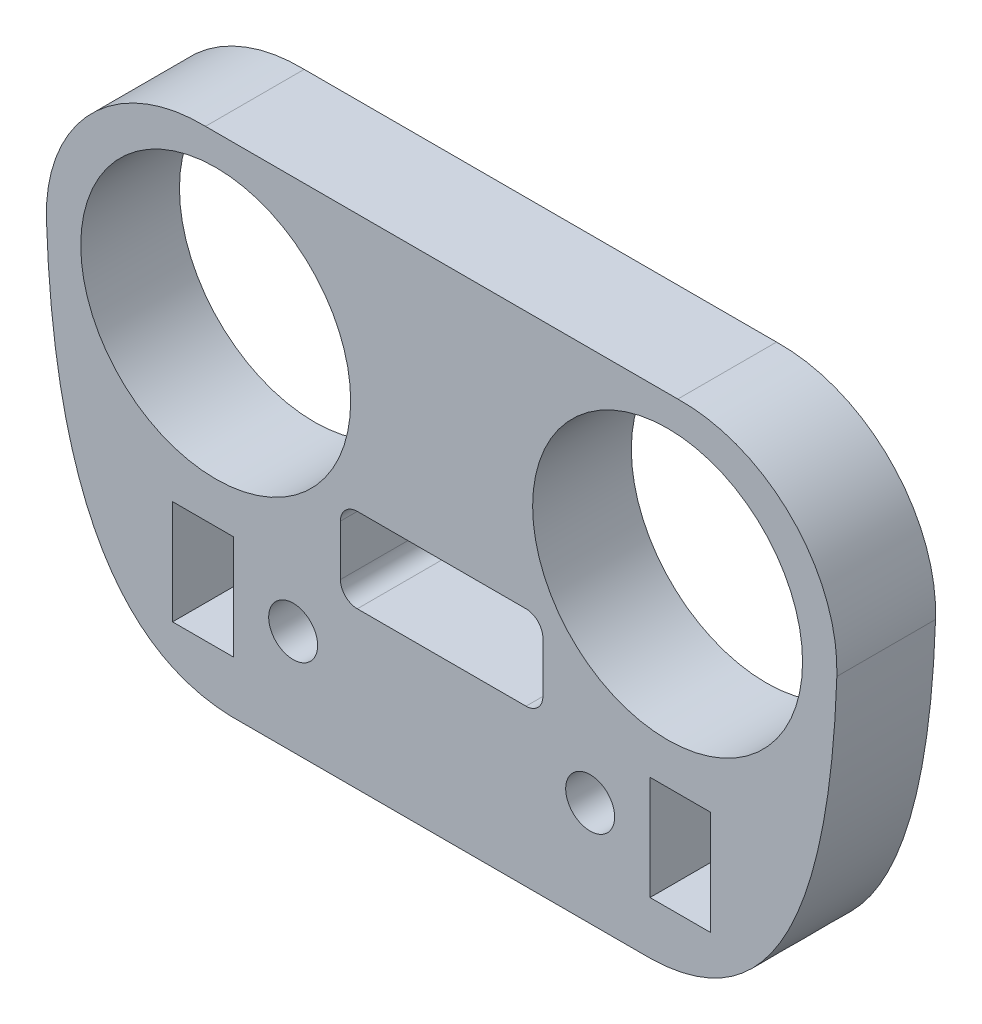
ISO-10303-21;
HEADER;
FILE_DESCRIPTION(('STEP AP214'),'2;1');
FILE_NAME('part.step','',(''),(''),'','','');
FILE_SCHEMA(('AUTOMOTIVE_DESIGN { 1 0 10303 214 1 1 1 1 }'));
ENDSEC;
DATA;
#1=APPLICATION_CONTEXT('core data for automotive mechanical design processes');
#2=APPLICATION_PROTOCOL_DEFINITION('international standard','automotive_design',2000,#1);
#3=PRODUCT_CONTEXT('',#1,'mechanical');
#4=PRODUCT('Part','Part','',(#3));
#5=PRODUCT_RELATED_PRODUCT_CATEGORY('part','',(#4));
#6=PRODUCT_DEFINITION_FORMATION('','',#4);
#7=PRODUCT_DEFINITION_CONTEXT('part definition',#1,'design');
#8=PRODUCT_DEFINITION('design','',#6,#7);
#9=PRODUCT_DEFINITION_SHAPE('','',#8);
#10=(LENGTH_UNIT() NAMED_UNIT(*) SI_UNIT(.MILLI.,.METRE.));
#11=(NAMED_UNIT(*) PLANE_ANGLE_UNIT() SI_UNIT($,.RADIAN.));
#12=(NAMED_UNIT(*) SI_UNIT($,.STERADIAN.) SOLID_ANGLE_UNIT());
#13=UNCERTAINTY_MEASURE_WITH_UNIT(LENGTH_MEASURE(1.E-05),#10,'distance_accuracy_value','');
#14=(GEOMETRIC_REPRESENTATION_CONTEXT(3) GLOBAL_UNCERTAINTY_ASSIGNED_CONTEXT((#13)) GLOBAL_UNIT_ASSIGNED_CONTEXT((#10,
#11,#12)) REPRESENTATION_CONTEXT('',''));
#15=CARTESIAN_POINT('',(0.,0.,0.));
#16=DIRECTION('',(0.,0.,1.));
#17=DIRECTION('',(1.,0.,0.));
#18=AXIS2_PLACEMENT_3D('',#15,#16,#17);
#19=CARTESIAN_POINT('',(540.459320757732,585.38923314869,5.85));
#20=DIRECTION('',(0.,0.,-1.));
#21=DIRECTION('',(-1.,0.,0.));
#22=AXIS2_PLACEMENT_3D('',#19,#20,#21);
#23=CYLINDRICAL_SURFACE('',#22,9.21331619618094);
#24=CARTESIAN_POINT('',(540.459320757732,585.38923314869,0.));
#25=DIRECTION('',(0.,0.,1.));
#26=DIRECTION('',(1.,0.,0.));
#27=AXIS2_PLACEMENT_3D('',#24,#25,#26);
#28=CIRCLE('',#27,9.21331619618094);
#29=CARTESIAN_POINT('',(531.251426748071,585.073190054068,0.));
#30=VERTEX_POINT('',#29);
#31=CARTESIAN_POINT('',(540.67744315862,594.599966992909,0.));
#32=VERTEX_POINT('',#31);
#33=EDGE_CURVE('E415',#30,#32,#28,.F.);
#34=ORIENTED_EDGE('',*,*,#33,.F.);
#35=DIRECTION('',(0.,0.,-1.));
#36=VECTOR('',#35,1.);
#37=CARTESIAN_POINT('',(531.251426748071,585.073190054068,5.85));
#38=LINE('',#37,#36);
#39=CARTESIAN_POINT('',(531.251426748071,585.073190054068,5.85));
#40=VERTEX_POINT('',#39);
#41=EDGE_CURVE('E11',#40,#30,#38,.T.);
#42=ORIENTED_EDGE('',*,*,#41,.F.);
#43=CARTESIAN_POINT('',(540.459320757732,585.38923314869,5.85));
#44=DIRECTION('',(0.,0.,1.));
#45=DIRECTION('',(1.,0.,0.));
#46=AXIS2_PLACEMENT_3D('',#43,#44,#45);
#47=CIRCLE('',#46,9.21331619618094);
#48=CARTESIAN_POINT('',(540.67744315862,594.599966992909,5.85));
#49=VERTEX_POINT('',#48);
#50=EDGE_CURVE('E244',#40,#49,#47,.F.);
#51=ORIENTED_EDGE('',*,*,#50,.T.);
#52=DIRECTION('',(0.,0.,-1.));
#53=VECTOR('',#52,1.);
#54=CARTESIAN_POINT('',(540.67744315862,594.599966992909,5.85));
#55=LINE('',#54,#53);
#56=EDGE_CURVE('E54',#49,#32,#55,.T.);
#57=ORIENTED_EDGE('',*,*,#56,.T.);
#58=EDGE_LOOP('',(#34,#42,#51,#57));
#59=FACE_BOUND('',#58,.T.);
#60=ADVANCED_FACE('F35',(#59),#23,.T.);
#61=CARTESIAN_POINT('',(531.251426748071,585.073190054068,5.85));
#62=CARTESIAN_POINT('',(531.926909632213,565.393042288273,5.85));
#63=CARTESIAN_POINT('',(542.192175731017,565.073190054068,5.85));
#64=B_SPLINE_CURVE_WITH_KNOTS('',2,(#61,#62,#63),.UNSPECIFIED.,.F.,.F.,(3,3),(0.,1.),.UNSPECIFIED.);
#65=DIRECTION('',(0.,0.,-1.));
#66=VECTOR('',#65,1.);
#67=SURFACE_OF_LINEAR_EXTRUSION('',#64,#66);
#68=CARTESIAN_POINT('',(531.251426748071,585.073190054068,0.));
#69=CARTESIAN_POINT('',(531.926909632213,565.393042288273,0.));
#70=CARTESIAN_POINT('',(542.192175731017,565.073190054068,0.));
#71=B_SPLINE_CURVE_WITH_KNOTS('',2,(#68,#69,#70),.UNSPECIFIED.,.F.,.F.,(3,3),(0.,1.),.UNSPECIFIED.);
#72=CARTESIAN_POINT('',(542.192175731017,565.073190054068,0.));
#73=VERTEX_POINT('',#72);
#74=EDGE_CURVE('E417',#30,#73,#71,.T.);
#75=ORIENTED_EDGE('',*,*,#74,.T.);
#76=DIRECTION('',(0.,0.,-1.));
#77=VECTOR('',#76,1.);
#78=CARTESIAN_POINT('',(542.192175731017,565.073190054068,5.85));
#79=LINE('',#78,#77);
#80=CARTESIAN_POINT('',(542.192175731017,565.073190054068,5.85));
#81=VERTEX_POINT('',#80);
#82=EDGE_CURVE('E45',#81,#73,#79,.T.);
#83=ORIENTED_EDGE('',*,*,#82,.F.);
#84=EDGE_CURVE('E216',#40,#81,#64,.T.);
#85=ORIENTED_EDGE('',*,*,#84,.F.);
#86=ORIENTED_EDGE('',*,*,#41,.T.);
#87=EDGE_LOOP('',(#75,#83,#85,#86));
#88=FACE_BOUND('',#87,.T.);
#89=ADVANCED_FACE('F234',(#88),#67,.F.);
#90=CARTESIAN_POINT('',(0.,565.073190054068,5.85));
#91=DIRECTION('',(0.,1.,0.));
#92=DIRECTION('',(0.,0.,1.));
#93=AXIS2_PLACEMENT_3D('',#90,#91,#92);
#94=PLANE('',#93);
#95=DIRECTION('',(1.,0.,0.));
#96=VECTOR('',#95,1.);
#97=CARTESIAN_POINT('',(0.,565.073190054068,0.));
#98=LINE('',#97,#96);
#99=CARTESIAN_POINT('',(567.160030566585,565.073190054068,0.));
#100=VERTEX_POINT('',#99);
#101=EDGE_CURVE('E422',#73,#100,#98,.T.);
#102=ORIENTED_EDGE('',*,*,#101,.T.);
#103=DIRECTION('',(0.,0.,-1.));
#104=VECTOR('',#103,1.);
#105=CARTESIAN_POINT('',(567.160030566585,565.073190054068,5.85));
#106=LINE('',#105,#104);
#107=CARTESIAN_POINT('',(567.160030566585,565.073190054068,5.85));
#108=VERTEX_POINT('',#107);
#109=EDGE_CURVE('E202',#108,#100,#106,.T.);
#110=ORIENTED_EDGE('',*,*,#109,.F.);
#111=DIRECTION('',(1.,0.,0.));
#112=VECTOR('',#111,1.);
#113=CARTESIAN_POINT('',(0.,565.073190054068,5.85));
#114=LINE('',#113,#112);
#115=EDGE_CURVE('E213',#81,#108,#114,.T.);
#116=ORIENTED_EDGE('',*,*,#115,.F.);
#117=ORIENTED_EDGE('',*,*,#82,.T.);
#118=EDGE_LOOP('',(#102,#110,#116,#117));
#119=FACE_BOUND('',#118,.T.);
#120=ADVANCED_FACE('F230',(#119),#94,.F.);
#121=CARTESIAN_POINT('',(578.100779549531,585.073190054068,5.85));
#122=CARTESIAN_POINT('',(577.425296665389,565.393042288278,5.85));
#123=CARTESIAN_POINT('',(567.160030566585,565.073190054068,5.85));
#124=B_SPLINE_CURVE_WITH_KNOTS('',2,(#121,#122,#123),.UNSPECIFIED.,.F.,.F.,(3,3),(0.,1.),.UNSPECIFIED.);
#125=DIRECTION('',(0.,0.,-1.));
#126=VECTOR('',#125,1.);
#127=SURFACE_OF_LINEAR_EXTRUSION('',#124,#126);
#128=CARTESIAN_POINT('',(578.100779549531,585.073190054068,0.));
#129=CARTESIAN_POINT('',(577.425296665389,565.393042288278,0.));
#130=CARTESIAN_POINT('',(567.160030566585,565.073190054068,0.));
#131=B_SPLINE_CURVE_WITH_KNOTS('',2,(#128,#129,#130),.UNSPECIFIED.,.F.,.F.,(3,3),(0.,1.),.UNSPECIFIED.);
#132=CARTESIAN_POINT('',(578.100779549531,585.073190054068,0.));
#133=VERTEX_POINT('',#132);
#134=EDGE_CURVE('E199',#133,#100,#131,.T.);
#135=ORIENTED_EDGE('',*,*,#134,.F.);
#136=DIRECTION('',(0.,0.,-1.));
#137=VECTOR('',#136,1.);
#138=CARTESIAN_POINT('',(578.100779549531,585.073190054068,5.85));
#139=LINE('',#138,#137);
#140=CARTESIAN_POINT('',(578.100779549531,585.073190054068,5.85));
#141=VERTEX_POINT('',#140);
#142=EDGE_CURVE('E193',#141,#133,#139,.T.);
#143=ORIENTED_EDGE('',*,*,#142,.F.);
#144=EDGE_CURVE('E197',#141,#108,#124,.T.);
#145=ORIENTED_EDGE('',*,*,#144,.T.);
#146=ORIENTED_EDGE('',*,*,#109,.T.);
#147=EDGE_LOOP('',(#135,#143,#145,#146));
#148=FACE_BOUND('',#147,.T.);
#149=ADVANCED_FACE('F195',(#148),#127,.T.);
#150=CARTESIAN_POINT('',(568.89288553987,585.38923314869,5.85));
#151=DIRECTION('',(0.,0.,-1.));
#152=DIRECTION('',(-1.,0.,0.));
#153=AXIS2_PLACEMENT_3D('',#150,#151,#152);
#154=CYLINDRICAL_SURFACE('',#153,9.21331619618094);
#155=CARTESIAN_POINT('',(568.89288553987,585.38923314869,0.));
#156=DIRECTION('',(0.,0.,1.));
#157=DIRECTION('',(1.,0.,0.));
#158=AXIS2_PLACEMENT_3D('',#155,#156,#157);
#159=CIRCLE('',#158,9.21331619618094);
#160=CARTESIAN_POINT('',(568.674763138983,594.599966992909,0.));
#161=VERTEX_POINT('',#160);
#162=EDGE_CURVE('E303',#133,#161,#159,.T.);
#163=ORIENTED_EDGE('',*,*,#162,.T.);
#164=DIRECTION('',(0.,0.,-1.));
#165=VECTOR('',#164,1.);
#166=CARTESIAN_POINT('',(568.674763138983,594.599966992909,5.85));
#167=LINE('',#166,#165);
#168=CARTESIAN_POINT('',(568.674763138983,594.599966992909,5.85));
#169=VERTEX_POINT('',#168);
#170=EDGE_CURVE('E122',#169,#161,#167,.T.);
#171=ORIENTED_EDGE('',*,*,#170,.F.);
#172=CARTESIAN_POINT('',(568.89288553987,585.38923314869,5.85));
#173=DIRECTION('',(0.,0.,1.));
#174=DIRECTION('',(1.,0.,0.));
#175=AXIS2_PLACEMENT_3D('',#172,#173,#174);
#176=CIRCLE('',#175,9.21331619618094);
#177=EDGE_CURVE('E204',#141,#169,#176,.T.);
#178=ORIENTED_EDGE('',*,*,#177,.F.);
#179=ORIENTED_EDGE('',*,*,#142,.T.);
#180=EDGE_LOOP('',(#163,#171,#178,#179));
#181=FACE_BOUND('',#180,.T.);
#182=ADVANCED_FACE('F205',(#181),#154,.T.);
#183=CARTESIAN_POINT('',(0.,574.359921054068,5.85));
#184=DIRECTION('',(0.,1.,0.));
#185=DIRECTION('',(0.,0.,1.));
#186=AXIS2_PLACEMENT_3D('',#183,#184,#185);
#187=PLANE('',#186);
#188=DIRECTION('',(1.,0.,0.));
#189=VECTOR('',#188,1.);
#190=CARTESIAN_POINT('',(0.,574.359921054068,0.));
#191=LINE('',#190,#189);
#192=CARTESIAN_POINT('',(538.725835586008,574.359921054068,0.));
#193=VERTEX_POINT('',#192);
#194=CARTESIAN_POINT('',(542.325835586008,574.359921054068,0.));
#195=VERTEX_POINT('',#194);
#196=EDGE_CURVE('E403',#193,#195,#191,.T.);
#197=ORIENTED_EDGE('',*,*,#196,.T.);
#198=DIRECTION('',(0.,0.,-1.));
#199=VECTOR('',#198,1.);
#200=CARTESIAN_POINT('',(542.325835586008,574.359921054068,5.85));
#201=LINE('',#200,#199);
#202=CARTESIAN_POINT('',(542.325835586008,574.359921054068,5.85));
#203=VERTEX_POINT('',#202);
#204=EDGE_CURVE('E310',#203,#195,#201,.T.);
#205=ORIENTED_EDGE('',*,*,#204,.F.);
#206=DIRECTION('',(1.,0.,0.));
#207=VECTOR('',#206,1.);
#208=CARTESIAN_POINT('',(0.,574.359921054068,5.85));
#209=LINE('',#208,#207);
#210=CARTESIAN_POINT('',(538.725835586008,574.359921054068,5.85));
#211=VERTEX_POINT('',#210);
#212=EDGE_CURVE('E258',#211,#203,#209,.T.);
#213=ORIENTED_EDGE('',*,*,#212,.F.);
#214=DIRECTION('',(0.,0.,-1.));
#215=VECTOR('',#214,1.);
#216=CARTESIAN_POINT('',(538.725835586008,574.359921054068,5.85));
#217=LINE('',#216,#215);
#218=EDGE_CURVE('E315',#211,#193,#217,.T.);
#219=ORIENTED_EDGE('',*,*,#218,.T.);
#220=EDGE_LOOP('',(#197,#205,#213,#219));
#221=FACE_BOUND('',#220,.T.);
#222=ADVANCED_FACE('F467',(#221),#187,.F.);
#223=CARTESIAN_POINT('',(542.325835586008,0.,5.85));
#224=DIRECTION('',(1.,0.,0.));
#225=DIRECTION('',(0.,0.,-1.));
#226=AXIS2_PLACEMENT_3D('',#223,#224,#225);
#227=PLANE('',#226);
#228=DIRECTION('',(0.,-1.,0.));
#229=VECTOR('',#228,1.);
#230=CARTESIAN_POINT('',(542.325835586008,0.,0.));
#231=LINE('',#230,#229);
#232=CARTESIAN_POINT('',(542.325835586008,568.186459054068,0.));
#233=VERTEX_POINT('',#232);
#234=EDGE_CURVE('E406',#195,#233,#231,.T.);
#235=ORIENTED_EDGE('',*,*,#234,.T.);
#236=DIRECTION('',(0.,0.,-1.));
#237=VECTOR('',#236,1.);
#238=CARTESIAN_POINT('',(542.325835586008,568.186459054068,5.85));
#239=LINE('',#238,#237);
#240=CARTESIAN_POINT('',(542.325835586008,568.186459054068,5.85));
#241=VERTEX_POINT('',#240);
#242=EDGE_CURVE('E322',#241,#233,#239,.T.);
#243=ORIENTED_EDGE('',*,*,#242,.F.);
#244=DIRECTION('',(0.,-1.,0.));
#245=VECTOR('',#244,1.);
#246=CARTESIAN_POINT('',(542.325835586008,0.,5.85));
#247=LINE('',#246,#245);
#248=EDGE_CURVE('E256',#203,#241,#247,.T.);
#249=ORIENTED_EDGE('',*,*,#248,.F.);
#250=ORIENTED_EDGE('',*,*,#204,.T.);
#251=EDGE_LOOP('',(#235,#243,#249,#250));
#252=FACE_BOUND('',#251,.T.);
#253=ADVANCED_FACE('F473',(#252),#227,.F.);
#254=CARTESIAN_POINT('',(0.,568.186459054068,5.85));
#255=DIRECTION('',(0.,-1.,0.));
#256=DIRECTION('',(0.,0.,-1.));
#257=AXIS2_PLACEMENT_3D('',#254,#255,#256);
#258=PLANE('',#257);
#259=DIRECTION('',(-1.,0.,0.));
#260=VECTOR('',#259,1.);
#261=CARTESIAN_POINT('',(0.,568.186459054068,0.));
#262=LINE('',#261,#260);
#263=CARTESIAN_POINT('',(538.725835586008,568.186459054068,0.));
#264=VERTEX_POINT('',#263);
#265=EDGE_CURVE('E408',#233,#264,#262,.T.);
#266=ORIENTED_EDGE('',*,*,#265,.T.);
#267=DIRECTION('',(0.,0.,-1.));
#268=VECTOR('',#267,1.);
#269=CARTESIAN_POINT('',(538.725835586008,568.186459054068,5.85));
#270=LINE('',#269,#268);
#271=CARTESIAN_POINT('',(538.725835586008,568.186459054068,5.85));
#272=VERTEX_POINT('',#271);
#273=EDGE_CURVE('E318',#272,#264,#270,.T.);
#274=ORIENTED_EDGE('',*,*,#273,.F.);
#275=DIRECTION('',(-1.,0.,0.));
#276=VECTOR('',#275,1.);
#277=CARTESIAN_POINT('',(0.,568.186459054068,5.85));
#278=LINE('',#277,#276);
#279=EDGE_CURVE('E254',#241,#272,#278,.T.);
#280=ORIENTED_EDGE('',*,*,#279,.F.);
#281=ORIENTED_EDGE('',*,*,#242,.T.);
#282=EDGE_LOOP('',(#266,#274,#280,#281));
#283=FACE_BOUND('',#282,.T.);
#284=ADVANCED_FACE('F481',(#283),#258,.F.);
#285=CARTESIAN_POINT('',(0.,568.186459054068,5.85));
#286=DIRECTION('',(0.,1.,0.));
#287=DIRECTION('',(0.,0.,1.));
#288=AXIS2_PLACEMENT_3D('',#285,#286,#287);
#289=PLANE('',#288);
#290=DIRECTION('',(1.,0.,0.));
#291=VECTOR('',#290,1.);
#292=CARTESIAN_POINT('',(0.,568.186459054068,0.));
#293=LINE('',#292,#291);
#294=CARTESIAN_POINT('',(567.026370711595,568.186459054068,0.));
#295=VERTEX_POINT('',#294);
#296=CARTESIAN_POINT('',(570.626370711595,568.186459054068,0.));
#297=VERTEX_POINT('',#296);
#298=EDGE_CURVE('E391',#295,#297,#293,.T.);
#299=ORIENTED_EDGE('',*,*,#298,.F.);
#300=DIRECTION('',(0.,0.,-1.));
#301=VECTOR('',#300,1.);
#302=CARTESIAN_POINT('',(567.026370711595,568.186459054068,5.85));
#303=LINE('',#302,#301);
#304=CARTESIAN_POINT('',(567.026370711595,568.186459054068,5.85));
#305=VERTEX_POINT('',#304);
#306=EDGE_CURVE('E319',#305,#295,#303,.T.);
#307=ORIENTED_EDGE('',*,*,#306,.F.);
#308=DIRECTION('',(1.,0.,0.));
#309=VECTOR('',#308,1.);
#310=CARTESIAN_POINT('',(0.,568.186459054068,5.85));
#311=LINE('',#310,#309);
#312=CARTESIAN_POINT('',(570.626370711595,568.186459054068,5.85));
#313=VERTEX_POINT('',#312);
#314=EDGE_CURVE('E270',#305,#313,#311,.T.);
#315=ORIENTED_EDGE('',*,*,#314,.T.);
#316=DIRECTION('',(0.,0.,-1.));
#317=VECTOR('',#316,1.);
#318=CARTESIAN_POINT('',(570.626370711595,568.186459054068,5.85));
#319=LINE('',#318,#317);
#320=EDGE_CURVE('E327',#313,#297,#319,.T.);
#321=ORIENTED_EDGE('',*,*,#320,.T.);
#322=EDGE_LOOP('',(#299,#307,#315,#321));
#323=FACE_BOUND('',#322,.T.);
#324=ADVANCED_FACE('F489',(#323),#289,.T.);
#325=CARTESIAN_POINT('',(567.026370711595,0.,5.85));
#326=DIRECTION('',(1.,0.,0.));
#327=DIRECTION('',(0.,0.,-1.));
#328=AXIS2_PLACEMENT_3D('',#325,#326,#327);
#329=PLANE('',#328);
#330=DIRECTION('',(0.,-1.,0.));
#331=VECTOR('',#330,1.);
#332=CARTESIAN_POINT('',(567.026370711595,0.,0.));
#333=LINE('',#332,#331);
#334=CARTESIAN_POINT('',(567.026370711595,574.359921054068,0.));
#335=VERTEX_POINT('',#334);
#336=EDGE_CURVE('E394',#335,#295,#333,.T.);
#337=ORIENTED_EDGE('',*,*,#336,.F.);
#338=DIRECTION('',(0.,0.,-1.));
#339=VECTOR('',#338,1.);
#340=CARTESIAN_POINT('',(567.026370711595,574.359921054068,5.85));
#341=LINE('',#340,#339);
#342=CARTESIAN_POINT('',(567.026370711595,574.359921054068,5.85));
#343=VERTEX_POINT('',#342);
#344=EDGE_CURVE('E331',#343,#335,#341,.T.);
#345=ORIENTED_EDGE('',*,*,#344,.F.);
#346=DIRECTION('',(0.,-1.,0.));
#347=VECTOR('',#346,1.);
#348=CARTESIAN_POINT('',(567.026370711595,0.,5.85));
#349=LINE('',#348,#347);
#350=EDGE_CURVE('E267',#343,#305,#349,.T.);
#351=ORIENTED_EDGE('',*,*,#350,.T.);
#352=ORIENTED_EDGE('',*,*,#306,.T.);
#353=EDGE_LOOP('',(#337,#345,#351,#352));
#354=FACE_BOUND('',#353,.T.);
#355=ADVANCED_FACE('F497',(#354),#329,.T.);
#356=CARTESIAN_POINT('',(0.,574.359921054068,5.85));
#357=DIRECTION('',(0.,-1.,0.));
#358=DIRECTION('',(0.,0.,-1.));
#359=AXIS2_PLACEMENT_3D('',#356,#357,#358);
#360=PLANE('',#359);
#361=DIRECTION('',(-1.,0.,0.));
#362=VECTOR('',#361,1.);
#363=CARTESIAN_POINT('',(0.,574.359921054068,0.));
#364=LINE('',#363,#362);
#365=CARTESIAN_POINT('',(570.626370711595,574.359921054068,0.));
#366=VERTEX_POINT('',#365);
#367=EDGE_CURVE('E397',#366,#335,#364,.T.);
#368=ORIENTED_EDGE('',*,*,#367,.F.);
#369=DIRECTION('',(0.,0.,-1.));
#370=VECTOR('',#369,1.);
#371=CARTESIAN_POINT('',(570.626370711595,574.359921054068,5.85));
#372=LINE('',#371,#370);
#373=CARTESIAN_POINT('',(570.626370711595,574.359921054068,5.85));
#374=VERTEX_POINT('',#373);
#375=EDGE_CURVE('E329',#374,#366,#372,.T.);
#376=ORIENTED_EDGE('',*,*,#375,.F.);
#377=DIRECTION('',(-1.,0.,0.));
#378=VECTOR('',#377,1.);
#379=CARTESIAN_POINT('',(0.,574.359921054068,5.85));
#380=LINE('',#379,#378);
#381=EDGE_CURVE('E264',#374,#343,#380,.T.);
#382=ORIENTED_EDGE('',*,*,#381,.T.);
#383=ORIENTED_EDGE('',*,*,#344,.T.);
#384=EDGE_LOOP('',(#368,#376,#382,#383));
#385=FACE_BOUND('',#384,.T.);
#386=ADVANCED_FACE('F505',(#385),#360,.T.);
#387=CARTESIAN_POINT('',(560.676103148801,0.,5.85));
#388=DIRECTION('',(1.,0.,0.));
#389=DIRECTION('',(0.,0.,-1.));
#390=AXIS2_PLACEMENT_3D('',#387,#388,#389);
#391=PLANE('',#390);
#392=DIRECTION('',(0.,-1.,0.));
#393=VECTOR('',#392,1.);
#394=CARTESIAN_POINT('',(560.676103148801,0.,0.));
#395=LINE('',#394,#393);
#396=CARTESIAN_POINT('',(560.676103148801,578.334674665132,0.));
#397=VERTEX_POINT('',#396);
#398=CARTESIAN_POINT('',(560.676103148801,575.334674665132,0.));
#399=VERTEX_POINT('',#398);
#400=EDGE_CURVE('E359',#397,#399,#395,.T.);
#401=ORIENTED_EDGE('',*,*,#400,.T.);
#402=DIRECTION('',(0.,0.,-1.));
#403=VECTOR('',#402,1.);
#404=CARTESIAN_POINT('',(560.676103148801,575.334674665132,5.85));
#405=LINE('',#404,#403);
#406=CARTESIAN_POINT('',(560.676103148801,575.334674665132,5.85));
#407=VERTEX_POINT('',#406);
#408=EDGE_CURVE('E39',#407,#399,#405,.T.);
#409=ORIENTED_EDGE('',*,*,#408,.F.);
#410=DIRECTION('',(0.,-1.,0.));
#411=VECTOR('',#410,1.);
#412=CARTESIAN_POINT('',(560.676103148801,0.,5.85));
#413=LINE('',#412,#411);
#414=CARTESIAN_POINT('',(560.676103148801,578.334674665132,5.85));
#415=VERTEX_POINT('',#414);
#416=EDGE_CURVE('E295',#415,#407,#413,.T.);
#417=ORIENTED_EDGE('',*,*,#416,.F.);
#418=DIRECTION('',(0.,0.,-1.));
#419=VECTOR('',#418,1.);
#420=CARTESIAN_POINT('',(560.676103148801,578.334674665132,5.85));
#421=LINE('',#420,#419);
#422=EDGE_CURVE('E334',#415,#397,#421,.T.);
#423=ORIENTED_EDGE('',*,*,#422,.T.);
#424=EDGE_LOOP('',(#401,#409,#417,#423));
#425=FACE_BOUND('',#424,.T.);
#426=ADVANCED_FACE('F360',(#425),#391,.F.);
#427=CARTESIAN_POINT('',(559.676103148801,575.334674665132,5.85));
#428=DIRECTION('',(0.,0.,-1.));
#429=DIRECTION('',(-1.,0.,0.));
#430=AXIS2_PLACEMENT_3D('',#427,#428,#429);
#431=CYLINDRICAL_SURFACE('',#430,1.);
#432=CARTESIAN_POINT('',(559.676103148801,575.334674665132,0.));
#433=DIRECTION('',(0.,0.,1.));
#434=DIRECTION('',(1.,0.,0.));
#435=AXIS2_PLACEMENT_3D('',#432,#433,#434);
#436=CIRCLE('',#435,1.);
#437=CARTESIAN_POINT('',(559.676103148801,574.334674665132,0.));
#438=VERTEX_POINT('',#437);
#439=EDGE_CURVE('E355',#399,#438,#436,.F.);
#440=ORIENTED_EDGE('',*,*,#439,.T.);
#441=DIRECTION('',(0.,0.,-1.));
#442=VECTOR('',#441,1.);
#443=CARTESIAN_POINT('',(559.676103148801,574.334674665132,5.85));
#444=LINE('',#443,#442);
#445=CARTESIAN_POINT('',(559.676103148801,574.334674665132,5.85));
#446=VERTEX_POINT('',#445);
#447=EDGE_CURVE('E346',#446,#438,#444,.T.);
#448=ORIENTED_EDGE('',*,*,#447,.F.);
#449=CARTESIAN_POINT('',(559.676103148801,575.334674665132,5.85));
#450=DIRECTION('',(0.,0.,1.));
#451=DIRECTION('',(1.,0.,0.));
#452=AXIS2_PLACEMENT_3D('',#449,#450,#451);
#453=CIRCLE('',#452,1.);
#454=EDGE_CURVE('E135',#407,#446,#453,.F.);
#455=ORIENTED_EDGE('',*,*,#454,.F.);
#456=ORIENTED_EDGE('',*,*,#408,.T.);
#457=EDGE_LOOP('',(#440,#448,#455,#456));
#458=FACE_BOUND('',#457,.T.);
#459=ADVANCED_FACE('F354',(#458),#431,.F.);
#460=CARTESIAN_POINT('',(0.,574.334674665132,5.85));
#461=DIRECTION('',(0.,-1.,0.));
#462=DIRECTION('',(0.,0.,-1.));
#463=AXIS2_PLACEMENT_3D('',#460,#461,#462);
#464=PLANE('',#463);
#465=DIRECTION('',(-1.,0.,0.));
#466=VECTOR('',#465,1.);
#467=CARTESIAN_POINT('',(0.,574.334674665132,0.));
#468=LINE('',#467,#466);
#469=CARTESIAN_POINT('',(549.676103148801,574.334674665132,0.));
#470=VERTEX_POINT('',#469);
#471=EDGE_CURVE('E366',#438,#470,#468,.T.);
#472=ORIENTED_EDGE('',*,*,#471,.T.);
#473=DIRECTION('',(0.,0.,-1.));
#474=VECTOR('',#473,1.);
#475=CARTESIAN_POINT('',(549.676103148801,574.334674665132,5.85));
#476=LINE('',#475,#474);
#477=CARTESIAN_POINT('',(549.676103148801,574.334674665132,5.85));
#478=VERTEX_POINT('',#477);
#479=EDGE_CURVE('E345',#478,#470,#476,.T.);
#480=ORIENTED_EDGE('',*,*,#479,.F.);
#481=DIRECTION('',(-1.,0.,0.));
#482=VECTOR('',#481,1.);
#483=CARTESIAN_POINT('',(0.,574.334674665132,5.85));
#484=LINE('',#483,#482);
#485=EDGE_CURVE('E292',#446,#478,#484,.T.);
#486=ORIENTED_EDGE('',*,*,#485,.F.);
#487=ORIENTED_EDGE('',*,*,#447,.T.);
#488=EDGE_LOOP('',(#472,#480,#486,#487));
#489=FACE_BOUND('',#488,.T.);
#490=ADVANCED_FACE('F525',(#489),#464,.F.);
#491=CARTESIAN_POINT('',(549.676103148801,575.334674665132,5.85));
#492=DIRECTION('',(0.,0.,-1.));
#493=DIRECTION('',(-1.,0.,0.));
#494=AXIS2_PLACEMENT_3D('',#491,#492,#493);
#495=CYLINDRICAL_SURFACE('',#494,1.);
#496=CARTESIAN_POINT('',(549.676103148801,575.334674665132,0.));
#497=DIRECTION('',(0.,0.,1.));
#498=DIRECTION('',(1.,0.,0.));
#499=AXIS2_PLACEMENT_3D('',#496,#497,#498);
#500=CIRCLE('',#499,1.);
#501=CARTESIAN_POINT('',(548.676103148801,575.334674665132,0.));
#502=VERTEX_POINT('',#501);
#503=EDGE_CURVE('E372',#502,#470,#500,.T.);
#504=ORIENTED_EDGE('',*,*,#503,.F.);
#505=DIRECTION('',(0.,0.,-1.));
#506=VECTOR('',#505,1.);
#507=CARTESIAN_POINT('',(548.676103148801,575.334674665132,5.85));
#508=LINE('',#507,#506);
#509=CARTESIAN_POINT('',(548.676103148801,575.334674665132,5.85));
#510=VERTEX_POINT('',#509);
#511=EDGE_CURVE('E343',#510,#502,#508,.T.);
#512=ORIENTED_EDGE('',*,*,#511,.F.);
#513=CARTESIAN_POINT('',(549.676103148801,575.334674665132,5.85));
#514=DIRECTION('',(0.,0.,1.));
#515=DIRECTION('',(1.,0.,0.));
#516=AXIS2_PLACEMENT_3D('',#513,#514,#515);
#517=CIRCLE('',#516,1.);
#518=EDGE_CURVE('E289',#510,#478,#517,.T.);
#519=ORIENTED_EDGE('',*,*,#518,.T.);
#520=ORIENTED_EDGE('',*,*,#479,.T.);
#521=EDGE_LOOP('',(#504,#512,#519,#520));
#522=FACE_BOUND('',#521,.T.);
#523=ADVANCED_FACE('F532',(#522),#495,.F.);
#524=CARTESIAN_POINT('',(548.676103148801,0.,5.85));
#525=DIRECTION('',(1.,0.,0.));
#526=DIRECTION('',(0.,0.,-1.));
#527=AXIS2_PLACEMENT_3D('',#524,#525,#526);
#528=PLANE('',#527);
#529=DIRECTION('',(0.,-1.,0.));
#530=VECTOR('',#529,1.);
#531=CARTESIAN_POINT('',(548.676103148801,0.,0.));
#532=LINE('',#531,#530);
#533=CARTESIAN_POINT('',(548.676103148801,578.334674665132,0.));
#534=VERTEX_POINT('',#533);
#535=EDGE_CURVE('E375',#534,#502,#532,.T.);
#536=ORIENTED_EDGE('',*,*,#535,.F.);
#537=DIRECTION('',(0.,0.,-1.));
#538=VECTOR('',#537,1.);
#539=CARTESIAN_POINT('',(548.676103148801,578.334674665132,5.85));
#540=LINE('',#539,#538);
#541=CARTESIAN_POINT('',(548.676103148801,578.334674665132,5.85));
#542=VERTEX_POINT('',#541);
#543=EDGE_CURVE('E341',#542,#534,#540,.T.);
#544=ORIENTED_EDGE('',*,*,#543,.F.);
#545=DIRECTION('',(0.,-1.,0.));
#546=VECTOR('',#545,1.);
#547=CARTESIAN_POINT('',(548.676103148801,0.,5.85));
#548=LINE('',#547,#546);
#549=EDGE_CURVE('E286',#542,#510,#548,.T.);
#550=ORIENTED_EDGE('',*,*,#549,.T.);
#551=ORIENTED_EDGE('',*,*,#511,.T.);
#552=EDGE_LOOP('',(#536,#544,#550,#551));
#553=FACE_BOUND('',#552,.T.);
#554=ADVANCED_FACE('F539',(#553),#528,.T.);
#555=CARTESIAN_POINT('',(549.676103148801,578.334674665132,5.85));
#556=DIRECTION('',(0.,0.,-1.));
#557=DIRECTION('',(-1.,0.,0.));
#558=AXIS2_PLACEMENT_3D('',#555,#556,#557);
#559=CYLINDRICAL_SURFACE('',#558,1.);
#560=CARTESIAN_POINT('',(549.676103148801,578.334674665132,0.));
#561=DIRECTION('',(0.,0.,1.));
#562=DIRECTION('',(1.,0.,0.));
#563=AXIS2_PLACEMENT_3D('',#560,#561,#562);
#564=CIRCLE('',#563,1.);
#565=CARTESIAN_POINT('',(549.676103148801,579.334674665132,0.));
#566=VERTEX_POINT('',#565);
#567=EDGE_CURVE('E378',#534,#566,#564,.F.);
#568=ORIENTED_EDGE('',*,*,#567,.T.);
#569=DIRECTION('',(0.,0.,-1.));
#570=VECTOR('',#569,1.);
#571=CARTESIAN_POINT('',(549.676103148801,579.334674665132,5.85));
#572=LINE('',#571,#570);
#573=CARTESIAN_POINT('',(549.676103148801,579.334674665132,5.85));
#574=VERTEX_POINT('',#573);
#575=EDGE_CURVE('E338',#574,#566,#572,.T.);
#576=ORIENTED_EDGE('',*,*,#575,.F.);
#577=CARTESIAN_POINT('',(549.676103148801,578.334674665132,5.85));
#578=DIRECTION('',(0.,0.,1.));
#579=DIRECTION('',(1.,0.,0.));
#580=AXIS2_PLACEMENT_3D('',#577,#578,#579);
#581=CIRCLE('',#580,1.);
#582=EDGE_CURVE('E284',#542,#574,#581,.F.);
#583=ORIENTED_EDGE('',*,*,#582,.F.);
#584=ORIENTED_EDGE('',*,*,#543,.T.);
#585=EDGE_LOOP('',(#568,#576,#583,#584));
#586=FACE_BOUND('',#585,.T.);
#587=ADVANCED_FACE('F547',(#586),#559,.F.);
#588=CARTESIAN_POINT('',(0.,579.334674665132,5.85));
#589=DIRECTION('',(0.,1.,0.));
#590=DIRECTION('',(0.,0.,1.));
#591=AXIS2_PLACEMENT_3D('',#588,#589,#590);
#592=PLANE('',#591);
#593=DIRECTION('',(1.,0.,0.));
#594=VECTOR('',#593,1.);
#595=CARTESIAN_POINT('',(0.,579.334674665132,0.));
#596=LINE('',#595,#594);
#597=CARTESIAN_POINT('',(559.676103148801,579.334674665132,0.));
#598=VERTEX_POINT('',#597);
#599=EDGE_CURVE('E380',#566,#598,#596,.T.);
#600=ORIENTED_EDGE('',*,*,#599,.T.);
#601=DIRECTION('',(0.,0.,-1.));
#602=VECTOR('',#601,1.);
#603=CARTESIAN_POINT('',(559.676103148801,579.334674665132,5.85));
#604=LINE('',#603,#602);
#605=CARTESIAN_POINT('',(559.676103148801,579.334674665132,5.85));
#606=VERTEX_POINT('',#605);
#607=EDGE_CURVE('E336',#606,#598,#604,.T.);
#608=ORIENTED_EDGE('',*,*,#607,.F.);
#609=DIRECTION('',(1.,0.,0.));
#610=VECTOR('',#609,1.);
#611=CARTESIAN_POINT('',(0.,579.334674665132,5.85));
#612=LINE('',#611,#610);
#613=EDGE_CURVE('E282',#574,#606,#612,.T.);
#614=ORIENTED_EDGE('',*,*,#613,.F.);
#615=ORIENTED_EDGE('',*,*,#575,.T.);
#616=EDGE_LOOP('',(#600,#608,#614,#615));
#617=FACE_BOUND('',#616,.T.);
#618=ADVANCED_FACE('F555',(#617),#592,.F.);
#619=CARTESIAN_POINT('',(568.068245003086,584.797511369111,5.85));
#620=DIRECTION('',(0.,0.,-1.));
#621=DIRECTION('',(-1.,0.,0.));
#622=AXIS2_PLACEMENT_3D('',#619,#620,#621);
#623=CYLINDRICAL_SURFACE('',#622,7.9999176308887);
#624=CARTESIAN_POINT('',(568.068245003086,584.797511369111,5.85));
#625=DIRECTION('',(0.,0.,1.));
#626=DIRECTION('',(1.,0.,0.));
#627=AXIS2_PLACEMENT_3D('',#624,#625,#626);
#628=CIRCLE('',#627,7.9999176308887);
#629=CARTESIAN_POINT('',(576.068162633975,584.797511369111,5.85));
#630=VERTEX_POINT('',#629);
#631=EDGE_CURVE('E249',#630,#630,#628,.F.);
#632=ORIENTED_EDGE('',*,*,#631,.F.);
#633=EDGE_LOOP('',(#632));
#634=FACE_BOUND('',#633,.T.);
#635=CARTESIAN_POINT('',(568.068245003086,584.797511369111,0.));
#636=DIRECTION('',(0.,0.,1.));
#637=DIRECTION('',(1.,0.,0.));
#638=AXIS2_PLACEMENT_3D('',#635,#636,#637);
#639=CIRCLE('',#638,7.9999176308887);
#640=CARTESIAN_POINT('',(576.068162633975,584.797511369111,0.));
#641=VERTEX_POINT('',#640);
#642=EDGE_CURVE('E412',#641,#641,#639,.F.);
#643=ORIENTED_EDGE('',*,*,#642,.T.);
#644=EDGE_LOOP('',(#643));
#645=FACE_BOUND('',#644,.T.);
#646=ADVANCED_FACE('F563',(#634,#645),#623,.F.);
#647=CARTESIAN_POINT('',(538.725835586008,0.,5.85));
#648=DIRECTION('',(-1.,0.,0.));
#649=DIRECTION('',(0.,0.,1.));
#650=AXIS2_PLACEMENT_3D('',#647,#648,#649);
#651=PLANE('',#650);
#652=DIRECTION('',(0.,1.,0.));
#653=VECTOR('',#652,1.);
#654=CARTESIAN_POINT('',(538.725835586008,0.,0.));
#655=LINE('',#654,#653);
#656=EDGE_CURVE('E410',#264,#193,#655,.T.);
#657=ORIENTED_EDGE('',*,*,#656,.T.);
#658=ORIENTED_EDGE('',*,*,#218,.F.);
#659=DIRECTION('',(0.,1.,0.));
#660=VECTOR('',#659,1.);
#661=CARTESIAN_POINT('',(538.725835586008,0.,5.85));
#662=LINE('',#661,#660);
#663=EDGE_CURVE('E252',#272,#211,#662,.T.);
#664=ORIENTED_EDGE('',*,*,#663,.F.);
#665=ORIENTED_EDGE('',*,*,#273,.T.);
#666=EDGE_LOOP('',(#657,#658,#664,#665));
#667=FACE_BOUND('',#666,.T.);
#668=ADVANCED_FACE('F571',(#667),#651,.F.);
#669=CARTESIAN_POINT('',(570.626370711595,0.,5.85));
#670=DIRECTION('',(-1.,0.,0.));
#671=DIRECTION('',(0.,0.,1.));
#672=AXIS2_PLACEMENT_3D('',#669,#670,#671);
#673=PLANE('',#672);
#674=DIRECTION('',(0.,1.,0.));
#675=VECTOR('',#674,1.);
#676=CARTESIAN_POINT('',(570.626370711595,0.,0.));
#677=LINE('',#676,#675);
#678=EDGE_CURVE('E400',#297,#366,#677,.T.);
#679=ORIENTED_EDGE('',*,*,#678,.F.);
#680=ORIENTED_EDGE('',*,*,#320,.F.);
#681=DIRECTION('',(0.,1.,0.));
#682=VECTOR('',#681,1.);
#683=CARTESIAN_POINT('',(570.626370711595,0.,5.85));
#684=LINE('',#683,#682);
#685=EDGE_CURVE('E261',#313,#374,#684,.T.);
#686=ORIENTED_EDGE('',*,*,#685,.T.);
#687=ORIENTED_EDGE('',*,*,#375,.T.);
#688=EDGE_LOOP('',(#679,#680,#686,#687));
#689=FACE_BOUND('',#688,.T.);
#690=ADVANCED_FACE('F578',(#689),#673,.T.);
#691=CARTESIAN_POINT('',(545.873791213739,571.273190054068,5.85));
#692=DIRECTION('',(0.,0.,-1.));
#693=DIRECTION('',(-1.,0.,0.));
#694=AXIS2_PLACEMENT_3D('',#691,#692,#693);
#695=CYLINDRICAL_SURFACE('',#694,1.44981293506269);
#696=CARTESIAN_POINT('',(545.873791213739,571.273190054068,5.85));
#697=DIRECTION('',(0.,0.,1.));
#698=DIRECTION('',(1.,0.,0.));
#699=AXIS2_PLACEMENT_3D('',#696,#697,#698);
#700=CIRCLE('',#699,1.44981293506269);
#701=CARTESIAN_POINT('',(547.323604148801,571.273190054068,5.85));
#702=VERTEX_POINT('',#701);
#703=EDGE_CURVE('E273',#702,#702,#700,.T.);
#704=ORIENTED_EDGE('',*,*,#703,.T.);
#705=EDGE_LOOP('',(#704));
#706=FACE_BOUND('',#705,.T.);
#707=CARTESIAN_POINT('',(545.873791213739,571.273190054068,0.));
#708=DIRECTION('',(0.,0.,1.));
#709=DIRECTION('',(1.,0.,0.));
#710=AXIS2_PLACEMENT_3D('',#707,#708,#709);
#711=CIRCLE('',#710,1.44981293506269);
#712=CARTESIAN_POINT('',(547.323604148801,571.273190054068,0.));
#713=VERTEX_POINT('',#712);
#714=EDGE_CURVE('E388',#713,#713,#711,.T.);
#715=ORIENTED_EDGE('',*,*,#714,.F.);
#716=EDGE_LOOP('',(#715));
#717=FACE_BOUND('',#716,.T.);
#718=ADVANCED_FACE('F586',(#706,#717),#695,.F.);
#719=CARTESIAN_POINT('',(541.283961294517,584.797511369111,5.85));
#720=DIRECTION('',(0.,0.,-1.));
#721=DIRECTION('',(-1.,0.,0.));
#722=AXIS2_PLACEMENT_3D('',#719,#720,#721);
#723=CYLINDRICAL_SURFACE('',#722,7.99991763088868);
#724=CARTESIAN_POINT('',(541.283961294517,584.797511369111,5.85));
#725=DIRECTION('',(0.,0.,1.));
#726=DIRECTION('',(1.,0.,0.));
#727=AXIS2_PLACEMENT_3D('',#724,#725,#726);
#728=CIRCLE('',#727,7.99991763088868);
#729=CARTESIAN_POINT('',(549.283878925405,584.797511369111,5.85));
#730=VERTEX_POINT('',#729);
#731=EDGE_CURVE('E276',#730,#730,#728,.T.);
#732=ORIENTED_EDGE('',*,*,#731,.T.);
#733=EDGE_LOOP('',(#732));
#734=FACE_BOUND('',#733,.T.);
#735=CARTESIAN_POINT('',(541.283961294517,584.797511369111,0.));
#736=DIRECTION('',(0.,0.,1.));
#737=DIRECTION('',(1.,0.,0.));
#738=AXIS2_PLACEMENT_3D('',#735,#736,#737);
#739=CIRCLE('',#738,7.99991763088868);
#740=CARTESIAN_POINT('',(549.283878925405,584.797511369111,0.));
#741=VERTEX_POINT('',#740);
#742=EDGE_CURVE('E385',#741,#741,#739,.T.);
#743=ORIENTED_EDGE('',*,*,#742,.F.);
#744=EDGE_LOOP('',(#743));
#745=FACE_BOUND('',#744,.T.);
#746=ADVANCED_FACE('F594',(#734,#745),#723,.F.);
#747=CARTESIAN_POINT('',(559.676103148801,578.334674665132,5.85));
#748=DIRECTION('',(0.,0.,-1.));
#749=DIRECTION('',(-1.,0.,0.));
#750=AXIS2_PLACEMENT_3D('',#747,#748,#749);
#751=CYLINDRICAL_SURFACE('',#750,1.);
#752=CARTESIAN_POINT('',(559.676103148801,578.334674665132,0.));
#753=DIRECTION('',(0.,0.,1.));
#754=DIRECTION('',(1.,0.,0.));
#755=AXIS2_PLACEMENT_3D('',#752,#753,#754);
#756=CIRCLE('',#755,1.);
#757=EDGE_CURVE('E383',#397,#598,#756,.T.);
#758=ORIENTED_EDGE('',*,*,#757,.F.);
#759=ORIENTED_EDGE('',*,*,#422,.F.);
#760=CARTESIAN_POINT('',(559.676103148801,578.334674665132,5.85));
#761=DIRECTION('',(0.,0.,1.));
#762=DIRECTION('',(1.,0.,0.));
#763=AXIS2_PLACEMENT_3D('',#760,#761,#762);
#764=CIRCLE('',#763,1.);
#765=EDGE_CURVE('E279',#415,#606,#764,.T.);
#766=ORIENTED_EDGE('',*,*,#765,.T.);
#767=ORIENTED_EDGE('',*,*,#607,.T.);
#768=EDGE_LOOP('',(#758,#759,#766,#767));
#769=FACE_BOUND('',#768,.T.);
#770=ADVANCED_FACE('F443',(#769),#751,.F.);
#771=CARTESIAN_POINT('',(563.478415083864,571.273190054068,5.85));
#772=DIRECTION('',(0.,0.,-1.));
#773=DIRECTION('',(-1.,0.,0.));
#774=AXIS2_PLACEMENT_3D('',#771,#772,#773);
#775=CYLINDRICAL_SURFACE('',#774,1.44981293506269);
#776=CARTESIAN_POINT('',(563.478415083864,571.273190054068,5.85));
#777=DIRECTION('',(0.,0.,1.));
#778=DIRECTION('',(1.,0.,0.));
#779=AXIS2_PLACEMENT_3D('',#776,#777,#778);
#780=CIRCLE('',#779,1.44981293506269);
#781=CARTESIAN_POINT('',(564.928228018927,571.273190054068,5.85));
#782=VERTEX_POINT('',#781);
#783=EDGE_CURVE('E297',#782,#782,#780,.F.);
#784=ORIENTED_EDGE('',*,*,#783,.F.);
#785=EDGE_LOOP('',(#784));
#786=FACE_BOUND('',#785,.T.);
#787=CARTESIAN_POINT('',(563.478415083864,571.273190054068,0.));
#788=DIRECTION('',(0.,0.,1.));
#789=DIRECTION('',(1.,0.,0.));
#790=AXIS2_PLACEMENT_3D('',#787,#788,#789);
#791=CIRCLE('',#790,1.44981293506269);
#792=CARTESIAN_POINT('',(564.928228018927,571.273190054068,0.));
#793=VERTEX_POINT('',#792);
#794=EDGE_CURVE('E364',#793,#793,#791,.F.);
#795=ORIENTED_EDGE('',*,*,#794,.T.);
#796=EDGE_LOOP('',(#795));
#797=FACE_BOUND('',#796,.T.);
#798=ADVANCED_FACE('F37',(#786,#797),#775,.F.);
#799=CARTESIAN_POINT('',(0.,594.599966992909,5.85));
#800=DIRECTION('',(0.,1.,0.));
#801=DIRECTION('',(0.,0.,1.));
#802=AXIS2_PLACEMENT_3D('',#799,#800,#801);
#803=PLANE('',#802);
#804=DIRECTION('',(1.,0.,0.));
#805=VECTOR('',#804,1.);
#806=CARTESIAN_POINT('',(0.,594.599966992909,0.));
#807=LINE('',#806,#805);
#808=EDGE_CURVE('E299',#32,#161,#807,.T.);
#809=ORIENTED_EDGE('',*,*,#808,.F.);
#810=ORIENTED_EDGE('',*,*,#56,.F.);
#811=DIRECTION('',(1.,0.,0.));
#812=VECTOR('',#811,1.);
#813=CARTESIAN_POINT('',(0.,594.599966992909,5.85));
#814=LINE('',#813,#812);
#815=EDGE_CURVE('E208',#49,#169,#814,.T.);
#816=ORIENTED_EDGE('',*,*,#815,.T.);
#817=ORIENTED_EDGE('',*,*,#170,.T.);
#818=EDGE_LOOP('',(#809,#810,#816,#817));
#819=FACE_BOUND('',#818,.T.);
#820=ADVANCED_FACE('F436',(#819),#803,.T.);
#821=CARTESIAN_POINT('',(0.,0.,5.85));
#822=DIRECTION('',(0.,0.,1.));
#823=DIRECTION('',(1.,0.,0.));
#824=AXIS2_PLACEMENT_3D('',#821,#822,#823);
#825=PLANE('',#824);
#826=ORIENTED_EDGE('',*,*,#783,.T.);
#827=EDGE_LOOP('',(#826));
#828=FACE_BOUND('',#827,.T.);
#829=ORIENTED_EDGE('',*,*,#416,.T.);
#830=ORIENTED_EDGE('',*,*,#454,.T.);
#831=ORIENTED_EDGE('',*,*,#485,.T.);
#832=ORIENTED_EDGE('',*,*,#518,.F.);
#833=ORIENTED_EDGE('',*,*,#549,.F.);
#834=ORIENTED_EDGE('',*,*,#582,.T.);
#835=ORIENTED_EDGE('',*,*,#613,.T.);
#836=ORIENTED_EDGE('',*,*,#765,.F.);
#837=EDGE_LOOP('',(#829,#830,#831,#832,#833,#834,#835,#836));
#838=FACE_BOUND('',#837,.T.);
#839=ORIENTED_EDGE('',*,*,#731,.F.);
#840=EDGE_LOOP('',(#839));
#841=FACE_BOUND('',#840,.T.);
#842=ORIENTED_EDGE('',*,*,#703,.F.);
#843=EDGE_LOOP('',(#842));
#844=FACE_BOUND('',#843,.T.);
#845=ORIENTED_EDGE('',*,*,#314,.F.);
#846=ORIENTED_EDGE('',*,*,#350,.F.);
#847=ORIENTED_EDGE('',*,*,#381,.F.);
#848=ORIENTED_EDGE('',*,*,#685,.F.);
#849=EDGE_LOOP('',(#845,#846,#847,#848));
#850=FACE_BOUND('',#849,.T.);
#851=ORIENTED_EDGE('',*,*,#212,.T.);
#852=ORIENTED_EDGE('',*,*,#248,.T.);
#853=ORIENTED_EDGE('',*,*,#279,.T.);
#854=ORIENTED_EDGE('',*,*,#663,.T.);
#855=EDGE_LOOP('',(#851,#852,#853,#854));
#856=FACE_BOUND('',#855,.T.);
#857=ORIENTED_EDGE('',*,*,#631,.T.);
#858=EDGE_LOOP('',(#857));
#859=FACE_BOUND('',#858,.T.);
#860=ORIENTED_EDGE('',*,*,#50,.F.);
#861=ORIENTED_EDGE('',*,*,#84,.T.);
#862=ORIENTED_EDGE('',*,*,#115,.T.);
#863=ORIENTED_EDGE('',*,*,#144,.F.);
#864=ORIENTED_EDGE('',*,*,#177,.T.);
#865=ORIENTED_EDGE('',*,*,#815,.F.);
#866=EDGE_LOOP('',(#860,#861,#862,#863,#864,#865));
#867=FACE_BOUND('',#866,.T.);
#868=ADVANCED_FACE('F211',(#828,#838,#841,#844,#850,#856,#859,#867),#825,.T.);
#869=CARTESIAN_POINT('',(0.,0.,0.));
#870=DIRECTION('',(0.,0.,1.));
#871=DIRECTION('',(1.,0.,0.));
#872=AXIS2_PLACEMENT_3D('',#869,#870,#871);
#873=PLANE('',#872);
#874=ORIENTED_EDGE('',*,*,#794,.F.);
#875=EDGE_LOOP('',(#874));
#876=FACE_BOUND('',#875,.T.);
#877=ORIENTED_EDGE('',*,*,#400,.F.);
#878=ORIENTED_EDGE('',*,*,#757,.T.);
#879=ORIENTED_EDGE('',*,*,#599,.F.);
#880=ORIENTED_EDGE('',*,*,#567,.F.);
#881=ORIENTED_EDGE('',*,*,#535,.T.);
#882=ORIENTED_EDGE('',*,*,#503,.T.);
#883=ORIENTED_EDGE('',*,*,#471,.F.);
#884=ORIENTED_EDGE('',*,*,#439,.F.);
#885=EDGE_LOOP('',(#877,#878,#879,#880,#881,#882,#883,#884));
#886=FACE_BOUND('',#885,.T.);
#887=ORIENTED_EDGE('',*,*,#742,.T.);
#888=EDGE_LOOP('',(#887));
#889=FACE_BOUND('',#888,.T.);
#890=ORIENTED_EDGE('',*,*,#714,.T.);
#891=EDGE_LOOP('',(#890));
#892=FACE_BOUND('',#891,.T.);
#893=ORIENTED_EDGE('',*,*,#298,.T.);
#894=ORIENTED_EDGE('',*,*,#678,.T.);
#895=ORIENTED_EDGE('',*,*,#367,.T.);
#896=ORIENTED_EDGE('',*,*,#336,.T.);
#897=EDGE_LOOP('',(#893,#894,#895,#896));
#898=FACE_BOUND('',#897,.T.);
#899=ORIENTED_EDGE('',*,*,#196,.F.);
#900=ORIENTED_EDGE('',*,*,#656,.F.);
#901=ORIENTED_EDGE('',*,*,#265,.F.);
#902=ORIENTED_EDGE('',*,*,#234,.F.);
#903=EDGE_LOOP('',(#899,#900,#901,#902));
#904=FACE_BOUND('',#903,.T.);
#905=ORIENTED_EDGE('',*,*,#642,.F.);
#906=EDGE_LOOP('',(#905));
#907=FACE_BOUND('',#906,.T.);
#908=ORIENTED_EDGE('',*,*,#33,.T.);
#909=ORIENTED_EDGE('',*,*,#808,.T.);
#910=ORIENTED_EDGE('',*,*,#162,.F.);
#911=ORIENTED_EDGE('',*,*,#134,.T.);
#912=ORIENTED_EDGE('',*,*,#101,.F.);
#913=ORIENTED_EDGE('',*,*,#74,.F.);
#914=EDGE_LOOP('',(#908,#909,#910,#911,#912,#913));
#915=FACE_BOUND('',#914,.T.);
#916=ADVANCED_FACE('F432',(#876,#886,#889,#892,#898,#904,#907,#915),#873,.F.);
#917=CLOSED_SHELL('',(#60,#89,#120,#149,#182,#222,#253,#284,#324,#355,#386,#426,#459,#490,#523,
#554,#587,#618,#646,#668,#690,#718,#746,#770,#798,#820,#868,#916));
#918=MANIFOLD_SOLID_BREP('B2',#917);
#919=ADVANCED_BREP_SHAPE_REPRESENTATION('',(#18,#918),#14);
#920=SHAPE_DEFINITION_REPRESENTATION(#9,#919);
ENDSEC;
END-ISO-10303-21;
